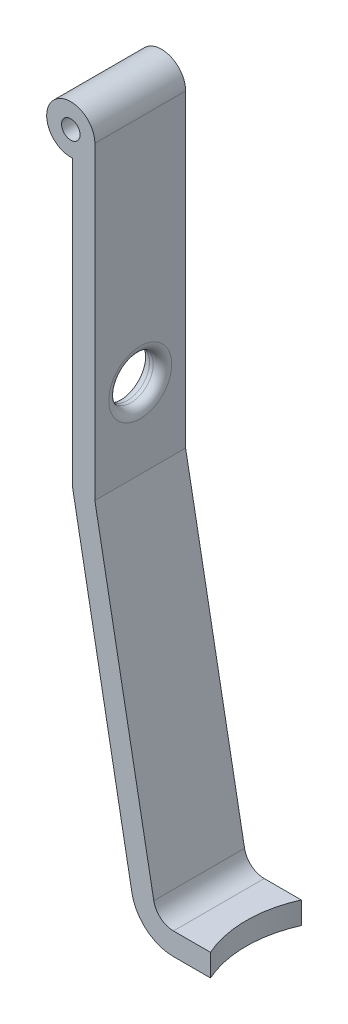
ISO-10303-21;
HEADER;
FILE_DESCRIPTION(('STEP AP214'),'2;1');
FILE_NAME('part.step','',(''),(''),'','','');
FILE_SCHEMA(('AUTOMOTIVE_DESIGN { 1 0 10303 214 1 1 1 1 }'));
ENDSEC;
DATA;
#1=APPLICATION_CONTEXT('core data for automotive mechanical design processes');
#2=APPLICATION_PROTOCOL_DEFINITION('international standard','automotive_design',2000,#1);
#3=PRODUCT_CONTEXT('',#1,'mechanical');
#4=PRODUCT('Part','Part','',(#3));
#5=PRODUCT_RELATED_PRODUCT_CATEGORY('part','',(#4));
#6=PRODUCT_DEFINITION_FORMATION('','',#4);
#7=PRODUCT_DEFINITION_CONTEXT('part definition',#1,'design');
#8=PRODUCT_DEFINITION('design','',#6,#7);
#9=PRODUCT_DEFINITION_SHAPE('','',#8);
#10=(LENGTH_UNIT() NAMED_UNIT(*) SI_UNIT(.MILLI.,.METRE.));
#11=(NAMED_UNIT(*) PLANE_ANGLE_UNIT() SI_UNIT($,.RADIAN.));
#12=(NAMED_UNIT(*) SI_UNIT($,.STERADIAN.) SOLID_ANGLE_UNIT());
#13=UNCERTAINTY_MEASURE_WITH_UNIT(LENGTH_MEASURE(1.E-05),#10,'distance_accuracy_value','');
#14=(GEOMETRIC_REPRESENTATION_CONTEXT(3) GLOBAL_UNCERTAINTY_ASSIGNED_CONTEXT((#13)) GLOBAL_UNIT_ASSIGNED_CONTEXT((#10,
#11,#12)) REPRESENTATION_CONTEXT('',''));
#15=CARTESIAN_POINT('',(0.,0.,0.));
#16=DIRECTION('',(0.,0.,1.));
#17=DIRECTION('',(1.,0.,0.));
#18=AXIS2_PLACEMENT_3D('',#15,#16,#17);
#19=CARTESIAN_POINT('',(13.8552846257266,-84.0403703492039,12.25));
#20=DIRECTION('',(0.,0.,1.));
#21=DIRECTION('',(1.,0.,0.));
#22=AXIS2_PLACEMENT_3D('',#19,#20,#21);
#23=PLANE('',#22);
#24=DIRECTION('',(0.181541589901783,-0.983383267671325,0.));
#25=VECTOR('',#24,1.);
#26=CARTESIAN_POINT('',(0.25000000000001,-41.7403703492039,12.25));
#27=LINE('',#26,#25);
#28=CARTESIAN_POINT('',(0.25000000000001,-41.7403703492039,12.25));
#29=VERTEX_POINT('',#28);
#30=CARTESIAN_POINT('',(8.25000000000001,-85.0751574116441,12.25));
#31=VERTEX_POINT('',#30);
#32=EDGE_CURVE('E179',#29,#31,#27,.T.);
#33=ORIENTED_EDGE('',*,*,#32,.T.);
#34=CARTESIAN_POINT('',(13.8552846257266,-84.0403703492039,12.25));
#35=DIRECTION('',(0.,0.,1.));
#36=DIRECTION('',(1.,0.,0.));
#37=AXIS2_PLACEMENT_3D('',#34,#35,#36);
#38=CIRCLE('',#37,5.7);
#39=CARTESIAN_POINT('',(13.8552846257266,-89.7403703492039,12.25));
#40=VERTEX_POINT('',#39);
#41=EDGE_CURVE('E106',#31,#40,#38,.T.);
#42=ORIENTED_EDGE('',*,*,#41,.T.);
#43=DIRECTION('',(1.,0.,0.));
#44=VECTOR('',#43,1.);
#45=CARTESIAN_POINT('',(18.8552846257266,-89.7403703492039,12.25));
#46=LINE('',#45,#44);
#47=CARTESIAN_POINT('',(18.8552846257266,-89.7403703492039,12.25));
#48=VERTEX_POINT('',#47);
#49=EDGE_CURVE('E285',#40,#48,#46,.T.);
#50=ORIENTED_EDGE('',*,*,#49,.T.);
#51=DIRECTION('',(0.,1.,0.));
#52=VECTOR('',#51,1.);
#53=CARTESIAN_POINT('',(18.8552846257266,-86.7403703492039,12.25));
#54=LINE('',#53,#52);
#55=CARTESIAN_POINT('',(18.8552846257266,-86.7403703492039,12.25));
#56=VERTEX_POINT('',#55);
#57=EDGE_CURVE('E291',#48,#56,#54,.T.);
#58=ORIENTED_EDGE('',*,*,#57,.T.);
#59=DIRECTION('',(-1.,0.,0.));
#60=VECTOR('',#59,1.);
#61=CARTESIAN_POINT('',(13.8552846257266,-86.7403703492039,12.25));
#62=LINE('',#61,#60);
#63=CARTESIAN_POINT('',(13.8552846257266,-86.7403703492039,12.25));
#64=VERTEX_POINT('',#63);
#65=EDGE_CURVE('E295',#56,#64,#62,.T.);
#66=ORIENTED_EDGE('',*,*,#65,.T.);
#67=CARTESIAN_POINT('',(13.8552846257266,-84.0403703492039,12.25));
#68=DIRECTION('',(0.,0.,-1.));
#69=DIRECTION('',(1.,0.,0.));
#70=AXIS2_PLACEMENT_3D('',#67,#68,#69);
#71=CIRCLE('',#70,2.70000000000001);
#72=CARTESIAN_POINT('',(11.2007129519146,-84.5335733789951,12.25));
#73=VERTEX_POINT('',#72);
#74=EDGE_CURVE('E302',#64,#73,#71,.T.);
#75=ORIENTED_EDGE('',*,*,#74,.T.);
#76=DIRECTION('',(-0.18266778881155,0.983174694004427,0.));
#77=VECTOR('',#76,1.);
#78=CARTESIAN_POINT('',(3.25,-41.7403703492039,12.25));
#79=LINE('',#78,#77);
#80=CARTESIAN_POINT('',(3.25,-41.7403703492039,12.25));
#81=VERTEX_POINT('',#80);
#82=EDGE_CURVE('E127',#73,#81,#79,.T.);
#83=ORIENTED_EDGE('',*,*,#82,.T.);
#84=DIRECTION('',(0.,1.,0.));
#85=VECTOR('',#84,1.);
#86=CARTESIAN_POINT('',(3.25,-41.7403703492039,12.25));
#87=LINE('',#86,#85);
#88=CARTESIAN_POINT('',(3.25,0.,12.25));
#89=VERTEX_POINT('',#88);
#90=EDGE_CURVE('E121',#81,#89,#87,.T.);
#91=ORIENTED_EDGE('',*,*,#90,.T.);
#92=CARTESIAN_POINT('',(0.,0.,12.25));
#93=DIRECTION('',(0.,0.,1.));
#94=DIRECTION('',(1.,0.,0.));
#95=AXIS2_PLACEMENT_3D('',#92,#93,#94);
#96=CIRCLE('',#95,3.25);
#97=CARTESIAN_POINT('',(0.250000000000005,-3.24037034920393,12.25));
#98=VERTEX_POINT('',#97);
#99=EDGE_CURVE('E125',#89,#98,#96,.T.);
#100=ORIENTED_EDGE('',*,*,#99,.T.);
#101=DIRECTION('',(0.,-1.,0.));
#102=VECTOR('',#101,1.);
#103=CARTESIAN_POINT('',(0.250000000000005,-3.24037034920393,12.25));
#104=LINE('',#103,#102);
#105=EDGE_CURVE('E58',#98,#29,#104,.T.);
#106=ORIENTED_EDGE('',*,*,#105,.T.);
#107=EDGE_LOOP('',(#33,#42,#50,#58,#66,#75,#83,#91,#100,#106));
#108=FACE_BOUND('',#107,.T.);
#109=CARTESIAN_POINT('',(0.,0.,12.25));
#110=DIRECTION('',(0.,0.,1.));
#111=DIRECTION('',(1.,0.,0.));
#112=AXIS2_PLACEMENT_3D('',#109,#110,#111);
#113=CIRCLE('',#112,1.25);
#114=CARTESIAN_POINT('',(1.25,0.,12.25));
#115=VERTEX_POINT('',#114);
#116=EDGE_CURVE('E154',#115,#115,#113,.T.);
#117=ORIENTED_EDGE('',*,*,#116,.F.);
#118=EDGE_LOOP('',(#117));
#119=FACE_BOUND('',#118,.T.);
#120=ADVANCED_FACE('F40',(#108,#119),#23,.T.);
#121=CARTESIAN_POINT('',(13.8552846257266,-84.0403703492039,0.));
#122=DIRECTION('',(0.,0.,1.));
#123=DIRECTION('',(1.,0.,0.));
#124=AXIS2_PLACEMENT_3D('',#121,#122,#123);
#125=PLANE('',#124);
#126=DIRECTION('',(0.181541589901783,-0.983383267671325,0.));
#127=VECTOR('',#126,1.);
#128=CARTESIAN_POINT('',(0.25000000000001,-41.7403703492039,0.));
#129=LINE('',#128,#127);
#130=CARTESIAN_POINT('',(0.25000000000001,-41.7403703492039,0.));
#131=VERTEX_POINT('',#130);
#132=CARTESIAN_POINT('',(8.25000000000001,-85.0751574116441,0.));
#133=VERTEX_POINT('',#132);
#134=EDGE_CURVE('E149',#131,#133,#129,.T.);
#135=ORIENTED_EDGE('',*,*,#134,.F.);
#136=DIRECTION('',(0.,-1.,0.));
#137=VECTOR('',#136,1.);
#138=CARTESIAN_POINT('',(0.250000000000005,-3.24037034920393,0.));
#139=LINE('',#138,#137);
#140=CARTESIAN_POINT('',(0.250000000000005,-3.24037034920393,0.));
#141=VERTEX_POINT('',#140);
#142=EDGE_CURVE('E97',#141,#131,#139,.T.);
#143=ORIENTED_EDGE('',*,*,#142,.F.);
#144=CARTESIAN_POINT('',(0.,0.,0.));
#145=DIRECTION('',(0.,0.,1.));
#146=DIRECTION('',(1.,0.,0.));
#147=AXIS2_PLACEMENT_3D('',#144,#145,#146);
#148=CIRCLE('',#147,3.25);
#149=CARTESIAN_POINT('',(3.25,0.,0.));
#150=VERTEX_POINT('',#149);
#151=EDGE_CURVE('E91',#150,#141,#148,.T.);
#152=ORIENTED_EDGE('',*,*,#151,.F.);
#153=DIRECTION('',(0.,1.,0.));
#154=VECTOR('',#153,1.);
#155=CARTESIAN_POINT('',(3.25,-41.7403703492039,0.));
#156=LINE('',#155,#154);
#157=CARTESIAN_POINT('',(3.25,-41.7403703492039,0.));
#158=VERTEX_POINT('',#157);
#159=EDGE_CURVE('E136',#158,#150,#156,.T.);
#160=ORIENTED_EDGE('',*,*,#159,.F.);
#161=DIRECTION('',(-0.18266778881155,0.983174694004427,0.));
#162=VECTOR('',#161,1.);
#163=CARTESIAN_POINT('',(3.25,-41.7403703492039,0.));
#164=LINE('',#163,#162);
#165=CARTESIAN_POINT('',(11.2007129519146,-84.5335733789951,0.));
#166=VERTEX_POINT('',#165);
#167=EDGE_CURVE('E170',#166,#158,#164,.T.);
#168=ORIENTED_EDGE('',*,*,#167,.F.);
#169=CARTESIAN_POINT('',(13.8552846257266,-84.0403703492039,0.));
#170=DIRECTION('',(0.,0.,-1.));
#171=DIRECTION('',(1.,0.,0.));
#172=AXIS2_PLACEMENT_3D('',#169,#170,#171);
#173=CIRCLE('',#172,2.70000000000001);
#174=CARTESIAN_POINT('',(13.8552846257266,-86.7403703492039,0.));
#175=VERTEX_POINT('',#174);
#176=EDGE_CURVE('E167',#175,#166,#173,.T.);
#177=ORIENTED_EDGE('',*,*,#176,.F.);
#178=DIRECTION('',(-1.,0.,0.));
#179=VECTOR('',#178,1.);
#180=CARTESIAN_POINT('',(13.8552846257266,-86.7403703492039,0.));
#181=LINE('',#180,#179);
#182=CARTESIAN_POINT('',(18.8552846257266,-86.7403703492039,0.));
#183=VERTEX_POINT('',#182);
#184=EDGE_CURVE('E164',#183,#175,#181,.T.);
#185=ORIENTED_EDGE('',*,*,#184,.F.);
#186=DIRECTION('',(0.,1.,0.));
#187=VECTOR('',#186,1.);
#188=CARTESIAN_POINT('',(18.8552846257266,-86.7403703492039,0.));
#189=LINE('',#188,#187);
#190=CARTESIAN_POINT('',(18.8552846257266,-89.7403703492039,0.));
#191=VERTEX_POINT('',#190);
#192=EDGE_CURVE('E161',#191,#183,#189,.T.);
#193=ORIENTED_EDGE('',*,*,#192,.F.);
#194=DIRECTION('',(1.,0.,0.));
#195=VECTOR('',#194,1.);
#196=CARTESIAN_POINT('',(18.8552846257266,-89.7403703492039,0.));
#197=LINE('',#196,#195);
#198=CARTESIAN_POINT('',(13.8552846257266,-89.7403703492039,0.));
#199=VERTEX_POINT('',#198);
#200=EDGE_CURVE('E157',#199,#191,#197,.T.);
#201=ORIENTED_EDGE('',*,*,#200,.F.);
#202=CARTESIAN_POINT('',(13.8552846257266,-84.0403703492039,0.));
#203=DIRECTION('',(0.,0.,1.));
#204=DIRECTION('',(1.,0.,0.));
#205=AXIS2_PLACEMENT_3D('',#202,#203,#204);
#206=CIRCLE('',#205,5.7);
#207=EDGE_CURVE('E153',#133,#199,#206,.T.);
#208=ORIENTED_EDGE('',*,*,#207,.F.);
#209=EDGE_LOOP('',(#135,#143,#152,#160,#168,#177,#185,#193,#201,#208));
#210=FACE_BOUND('',#209,.T.);
#211=CARTESIAN_POINT('',(0.,0.,0.));
#212=DIRECTION('',(0.,0.,1.));
#213=DIRECTION('',(1.,0.,0.));
#214=AXIS2_PLACEMENT_3D('',#211,#212,#213);
#215=CIRCLE('',#214,1.25);
#216=CARTESIAN_POINT('',(1.25,0.,0.));
#217=VERTEX_POINT('',#216);
#218=EDGE_CURVE('E318',#217,#217,#215,.T.);
#219=ORIENTED_EDGE('',*,*,#218,.T.);
#220=EDGE_LOOP('',(#219));
#221=FACE_BOUND('',#220,.T.);
#222=ADVANCED_FACE('F235',(#210,#221),#125,.F.);
#223=CARTESIAN_POINT('',(0.25000000000001,-41.7403703492039,12.25));
#224=DIRECTION('',(0.983383267671325,0.181541589901783,0.));
#225=DIRECTION('',(-0.181541589901783,0.983383267671325,0.));
#226=AXIS2_PLACEMENT_3D('',#223,#224,#225);
#227=PLANE('',#226);
#228=ORIENTED_EDGE('',*,*,#134,.T.);
#229=DIRECTION('',(0.,0.,-1.));
#230=VECTOR('',#229,1.);
#231=CARTESIAN_POINT('',(8.25000000000001,-85.0751574116441,12.25));
#232=LINE('',#231,#230);
#233=EDGE_CURVE('E198',#31,#133,#232,.T.);
#234=ORIENTED_EDGE('',*,*,#233,.F.);
#235=ORIENTED_EDGE('',*,*,#32,.F.);
#236=DIRECTION('',(0.,0.,-1.));
#237=VECTOR('',#236,1.);
#238=CARTESIAN_POINT('',(0.25000000000001,-41.7403703492039,12.25));
#239=LINE('',#238,#237);
#240=EDGE_CURVE('E145',#29,#131,#239,.T.);
#241=ORIENTED_EDGE('',*,*,#240,.T.);
#242=EDGE_LOOP('',(#228,#234,#235,#241));
#243=FACE_BOUND('',#242,.T.);
#244=ADVANCED_FACE('F240',(#243),#227,.F.);
#245=CARTESIAN_POINT('',(13.8552846257266,-84.0403703492039,12.25));
#246=DIRECTION('',(0.,0.,-1.));
#247=DIRECTION('',(-1.,0.,0.));
#248=AXIS2_PLACEMENT_3D('',#245,#246,#247);
#249=CYLINDRICAL_SURFACE('',#248,5.7);
#250=ORIENTED_EDGE('',*,*,#207,.T.);
#251=DIRECTION('',(0.,0.,-1.));
#252=VECTOR('',#251,1.);
#253=CARTESIAN_POINT('',(13.8552846257266,-89.7403703492039,12.25));
#254=LINE('',#253,#252);
#255=EDGE_CURVE('E194',#40,#199,#254,.T.);
#256=ORIENTED_EDGE('',*,*,#255,.F.);
#257=ORIENTED_EDGE('',*,*,#41,.F.);
#258=ORIENTED_EDGE('',*,*,#233,.T.);
#259=EDGE_LOOP('',(#250,#256,#257,#258));
#260=FACE_BOUND('',#259,.T.);
#261=ADVANCED_FACE('F268',(#260),#249,.T.);
#262=CARTESIAN_POINT('',(18.8552846257266,-89.7403703492039,12.25));
#263=DIRECTION('',(0.,1.,0.));
#264=DIRECTION('',(0.,0.,1.));
#265=AXIS2_PLACEMENT_3D('',#262,#263,#264);
#266=PLANE('',#265);
#267=ORIENTED_EDGE('',*,*,#200,.T.);
#268=CARTESIAN_POINT('',(32.5477780071381,-89.7403703492039,6.125));
#269=DIRECTION('',(0.,1.,0.));
#270=DIRECTION('',(0.,0.,1.));
#271=AXIS2_PLACEMENT_3D('',#268,#269,#270);
#272=CIRCLE('',#271,15.);
#273=EDGE_CURVE('E288',#48,#191,#272,.F.);
#274=ORIENTED_EDGE('',*,*,#273,.F.);
#275=ORIENTED_EDGE('',*,*,#49,.F.);
#276=ORIENTED_EDGE('',*,*,#255,.T.);
#277=EDGE_LOOP('',(#267,#274,#275,#276));
#278=FACE_BOUND('',#277,.T.);
#279=ADVANCED_FACE('F264',(#278),#266,.F.);
#280=CARTESIAN_POINT('',(13.8552846257266,-86.7403703492039,12.25));
#281=DIRECTION('',(0.,-1.,0.));
#282=DIRECTION('',(0.,0.,-1.));
#283=AXIS2_PLACEMENT_3D('',#280,#281,#282);
#284=PLANE('',#283);
#285=ORIENTED_EDGE('',*,*,#65,.F.);
#286=CARTESIAN_POINT('',(32.5477780071381,-86.7403703492039,6.125));
#287=DIRECTION('',(0.,1.,0.));
#288=DIRECTION('',(0.,0.,1.));
#289=AXIS2_PLACEMENT_3D('',#286,#287,#288);
#290=CIRCLE('',#289,15.);
#291=EDGE_CURVE('E314',#183,#56,#290,.T.);
#292=ORIENTED_EDGE('',*,*,#291,.F.);
#293=ORIENTED_EDGE('',*,*,#184,.T.);
#294=DIRECTION('',(0.,0.,-1.));
#295=VECTOR('',#294,1.);
#296=CARTESIAN_POINT('',(13.8552846257266,-86.7403703492039,12.25));
#297=LINE('',#296,#295);
#298=EDGE_CURVE('E190',#64,#175,#297,.T.);
#299=ORIENTED_EDGE('',*,*,#298,.F.);
#300=EDGE_LOOP('',(#285,#292,#293,#299));
#301=FACE_BOUND('',#300,.T.);
#302=ADVANCED_FACE('F260',(#301),#284,.F.);
#303=CARTESIAN_POINT('',(13.8552846257266,-84.0403703492039,12.25));
#304=DIRECTION('',(0.,0.,-1.));
#305=DIRECTION('',(-1.,0.,0.));
#306=AXIS2_PLACEMENT_3D('',#303,#304,#305);
#307=CYLINDRICAL_SURFACE('',#306,2.70000000000001);
#308=ORIENTED_EDGE('',*,*,#176,.T.);
#309=DIRECTION('',(0.,0.,-1.));
#310=VECTOR('',#309,1.);
#311=CARTESIAN_POINT('',(11.2007129519146,-84.5335733789951,12.25));
#312=LINE('',#311,#310);
#313=EDGE_CURVE('E186',#73,#166,#312,.T.);
#314=ORIENTED_EDGE('',*,*,#313,.F.);
#315=ORIENTED_EDGE('',*,*,#74,.F.);
#316=ORIENTED_EDGE('',*,*,#298,.T.);
#317=EDGE_LOOP('',(#308,#314,#315,#316));
#318=FACE_BOUND('',#317,.T.);
#319=ADVANCED_FACE('F256',(#318),#307,.F.);
#320=CARTESIAN_POINT('',(3.25,-41.7403703492039,12.25));
#321=DIRECTION('',(-0.983174694004427,-0.18266778881155,0.));
#322=DIRECTION('',(0.18266778881155,-0.983174694004427,0.));
#323=AXIS2_PLACEMENT_3D('',#320,#321,#322);
#324=PLANE('',#323);
#325=ORIENTED_EDGE('',*,*,#167,.T.);
#326=DIRECTION('',(0.,0.,-1.));
#327=VECTOR('',#326,1.);
#328=CARTESIAN_POINT('',(3.25,-41.7403703492039,12.25));
#329=LINE('',#328,#327);
#330=EDGE_CURVE('E138',#81,#158,#329,.T.);
#331=ORIENTED_EDGE('',*,*,#330,.F.);
#332=ORIENTED_EDGE('',*,*,#82,.F.);
#333=ORIENTED_EDGE('',*,*,#313,.T.);
#334=EDGE_LOOP('',(#325,#331,#332,#333));
#335=FACE_BOUND('',#334,.T.);
#336=ADVANCED_FACE('F253',(#335),#324,.F.);
#337=CARTESIAN_POINT('',(3.25,-41.7403703492039,12.25));
#338=DIRECTION('',(-1.,0.,0.));
#339=DIRECTION('',(0.,-1.,0.));
#340=AXIS2_PLACEMENT_3D('',#337,#338,#339);
#341=PLANE('',#340);
#342=CARTESIAN_POINT('',(3.25,-31.,6.125));
#343=DIRECTION('',(-1.,0.,0.));
#344=DIRECTION('',(0.,-1.,0.));
#345=AXIS2_PLACEMENT_3D('',#342,#343,#344);
#346=CIRCLE('',#345,4.25);
#347=CARTESIAN_POINT('',(3.25,-35.25,6.125));
#348=VERTEX_POINT('',#347);
#349=EDGE_CURVE('E50',#348,#348,#346,.T.);
#350=ORIENTED_EDGE('',*,*,#349,.T.);
#351=EDGE_LOOP('',(#350));
#352=FACE_BOUND('',#351,.T.);
#353=ORIENTED_EDGE('',*,*,#159,.T.);
#354=DIRECTION('',(0.,0.,-1.));
#355=VECTOR('',#354,1.);
#356=CARTESIAN_POINT('',(3.25,0.,12.25));
#357=LINE('',#356,#355);
#358=EDGE_CURVE('E133',#89,#150,#357,.T.);
#359=ORIENTED_EDGE('',*,*,#358,.F.);
#360=ORIENTED_EDGE('',*,*,#90,.F.);
#361=ORIENTED_EDGE('',*,*,#330,.T.);
#362=EDGE_LOOP('',(#353,#359,#360,#361));
#363=FACE_BOUND('',#362,.T.);
#364=ADVANCED_FACE('F134',(#352,#363),#341,.F.);
#365=CARTESIAN_POINT('',(0.,0.,12.25));
#366=DIRECTION('',(0.,0.,-1.));
#367=DIRECTION('',(-1.,0.,0.));
#368=AXIS2_PLACEMENT_3D('',#365,#366,#367);
#369=CYLINDRICAL_SURFACE('',#368,3.25);
#370=ORIENTED_EDGE('',*,*,#151,.T.);
#371=DIRECTION('',(0.,0.,-1.));
#372=VECTOR('',#371,1.);
#373=CARTESIAN_POINT('',(0.250000000000005,-3.24037034920393,12.25));
#374=LINE('',#373,#372);
#375=EDGE_CURVE('E139',#98,#141,#374,.T.);
#376=ORIENTED_EDGE('',*,*,#375,.F.);
#377=ORIENTED_EDGE('',*,*,#99,.F.);
#378=ORIENTED_EDGE('',*,*,#358,.T.);
#379=EDGE_LOOP('',(#370,#376,#377,#378));
#380=FACE_BOUND('',#379,.T.);
#381=ADVANCED_FACE('F141',(#380),#369,.T.);
#382=CARTESIAN_POINT('',(0.250000000000005,-3.24037034920393,12.25));
#383=DIRECTION('',(1.,0.,0.));
#384=DIRECTION('',(0.,1.,0.));
#385=AXIS2_PLACEMENT_3D('',#382,#383,#384);
#386=PLANE('',#385);
#387=CARTESIAN_POINT('',(0.250000000000008,-31.,6.125));
#388=DIRECTION('',(1.,0.,0.));
#389=DIRECTION('',(0.,1.,0.));
#390=AXIS2_PLACEMENT_3D('',#387,#388,#389);
#391=CIRCLE('',#390,4.25);
#392=CARTESIAN_POINT('',(0.250000000000008,-26.75,6.125));
#393=VERTEX_POINT('',#392);
#394=EDGE_CURVE('E12',#393,#393,#391,.T.);
#395=ORIENTED_EDGE('',*,*,#394,.T.);
#396=EDGE_LOOP('',(#395));
#397=FACE_BOUND('',#396,.T.);
#398=ORIENTED_EDGE('',*,*,#142,.T.);
#399=ORIENTED_EDGE('',*,*,#240,.F.);
#400=ORIENTED_EDGE('',*,*,#105,.F.);
#401=ORIENTED_EDGE('',*,*,#375,.T.);
#402=EDGE_LOOP('',(#398,#399,#400,#401));
#403=FACE_BOUND('',#402,.T.);
#404=ADVANCED_FACE('F245',(#397,#403),#386,.F.);
#405=CARTESIAN_POINT('',(0.,0.,12.25));
#406=DIRECTION('',(0.,0.,-1.));
#407=DIRECTION('',(-1.,0.,0.));
#408=AXIS2_PLACEMENT_3D('',#405,#406,#407);
#409=CYLINDRICAL_SURFACE('',#408,1.25);
#410=ORIENTED_EDGE('',*,*,#116,.T.);
#411=EDGE_LOOP('',(#410));
#412=FACE_BOUND('',#411,.T.);
#413=ORIENTED_EDGE('',*,*,#218,.F.);
#414=EDGE_LOOP('',(#413));
#415=FACE_BOUND('',#414,.T.);
#416=ADVANCED_FACE('F221',(#412,#415),#409,.F.);
#417=CARTESIAN_POINT('',(18.8562846257266,-31.,6.125));
#418=DIRECTION('',(-1.,0.,0.));
#419=DIRECTION('',(0.,-1.,0.));
#420=AXIS2_PLACEMENT_3D('',#417,#418,#419);
#421=CYLINDRICAL_SURFACE('',#420,3.);
#422=CARTESIAN_POINT('',(2.00000000000001,-31.,6.125));
#423=DIRECTION('',(-1.,0.,0.));
#424=DIRECTION('',(0.,-1.,0.));
#425=AXIS2_PLACEMENT_3D('',#422,#423,#424);
#426=CIRCLE('',#425,3.);
#427=CARTESIAN_POINT('',(2.00000000000001,-34.,6.125));
#428=VERTEX_POINT('',#427);
#429=EDGE_CURVE('E205',#428,#428,#426,.F.);
#430=ORIENTED_EDGE('',*,*,#429,.T.);
#431=EDGE_LOOP('',(#430));
#432=FACE_BOUND('',#431,.T.);
#433=CARTESIAN_POINT('',(1.50000000000001,-31.,6.125));
#434=DIRECTION('',(1.,0.,0.));
#435=DIRECTION('',(0.,1.,0.));
#436=AXIS2_PLACEMENT_3D('',#433,#434,#435);
#437=CIRCLE('',#436,3.);
#438=CARTESIAN_POINT('',(1.50000000000001,-28.,6.125));
#439=VERTEX_POINT('',#438);
#440=EDGE_CURVE('E201',#439,#439,#437,.F.);
#441=ORIENTED_EDGE('',*,*,#440,.T.);
#442=EDGE_LOOP('',(#441));
#443=FACE_BOUND('',#442,.T.);
#444=ADVANCED_FACE('F216',(#432,#443),#421,.F.);
#445=CARTESIAN_POINT('',(2.00000000000001,-31.,6.125));
#446=DIRECTION('',(-1.,0.,0.));
#447=DIRECTION('',(0.,-1.,0.));
#448=AXIS2_PLACEMENT_3D('',#445,#446,#447);
#449=TOROIDAL_SURFACE('',#448,4.25,1.25);
#450=ORIENTED_EDGE('',*,*,#349,.F.);
#451=EDGE_LOOP('',(#450));
#452=FACE_BOUND('',#451,.T.);
#453=ORIENTED_EDGE('',*,*,#429,.F.);
#454=EDGE_LOOP('',(#453));
#455=FACE_BOUND('',#454,.T.);
#456=ADVANCED_FACE('F213',(#452,#455),#449,.T.);
#457=CARTESIAN_POINT('',(1.50000000000001,-31.,6.125));
#458=DIRECTION('',(1.,0.,0.));
#459=DIRECTION('',(0.,1.,0.));
#460=AXIS2_PLACEMENT_3D('',#457,#458,#459);
#461=TOROIDAL_SURFACE('',#460,4.25,1.25);
#462=ORIENTED_EDGE('',*,*,#394,.F.);
#463=EDGE_LOOP('',(#462));
#464=FACE_BOUND('',#463,.T.);
#465=ORIENTED_EDGE('',*,*,#440,.F.);
#466=EDGE_LOOP('',(#465));
#467=FACE_BOUND('',#466,.T.);
#468=ADVANCED_FACE('F42',(#464,#467),#461,.T.);
#469=CARTESIAN_POINT('',(32.5477780071381,-89.7413703492039,6.125));
#470=DIRECTION('',(0.,1.,0.));
#471=DIRECTION('',(0.,0.,1.));
#472=AXIS2_PLACEMENT_3D('',#469,#470,#471);
#473=CYLINDRICAL_SURFACE('',#472,15.);
#474=ORIENTED_EDGE('',*,*,#273,.T.);
#475=ORIENTED_EDGE('',*,*,#192,.T.);
#476=ORIENTED_EDGE('',*,*,#291,.T.);
#477=ORIENTED_EDGE('',*,*,#57,.F.);
#478=EDGE_LOOP('',(#474,#475,#476,#477));
#479=FACE_BOUND('',#478,.T.);
#480=ADVANCED_FACE('F226',(#479),#473,.F.);
#481=CLOSED_SHELL('',(#120,#222,#244,#261,#279,#302,#319,#336,#364,#381,#404,#416,#444,#456,
#468,#480));
#482=MANIFOLD_SOLID_BREP('B2',#481);
#483=ADVANCED_BREP_SHAPE_REPRESENTATION('',(#18,#482),#14);
#484=SHAPE_DEFINITION_REPRESENTATION(#9,#483);
ENDSEC;
END-ISO-10303-21;
